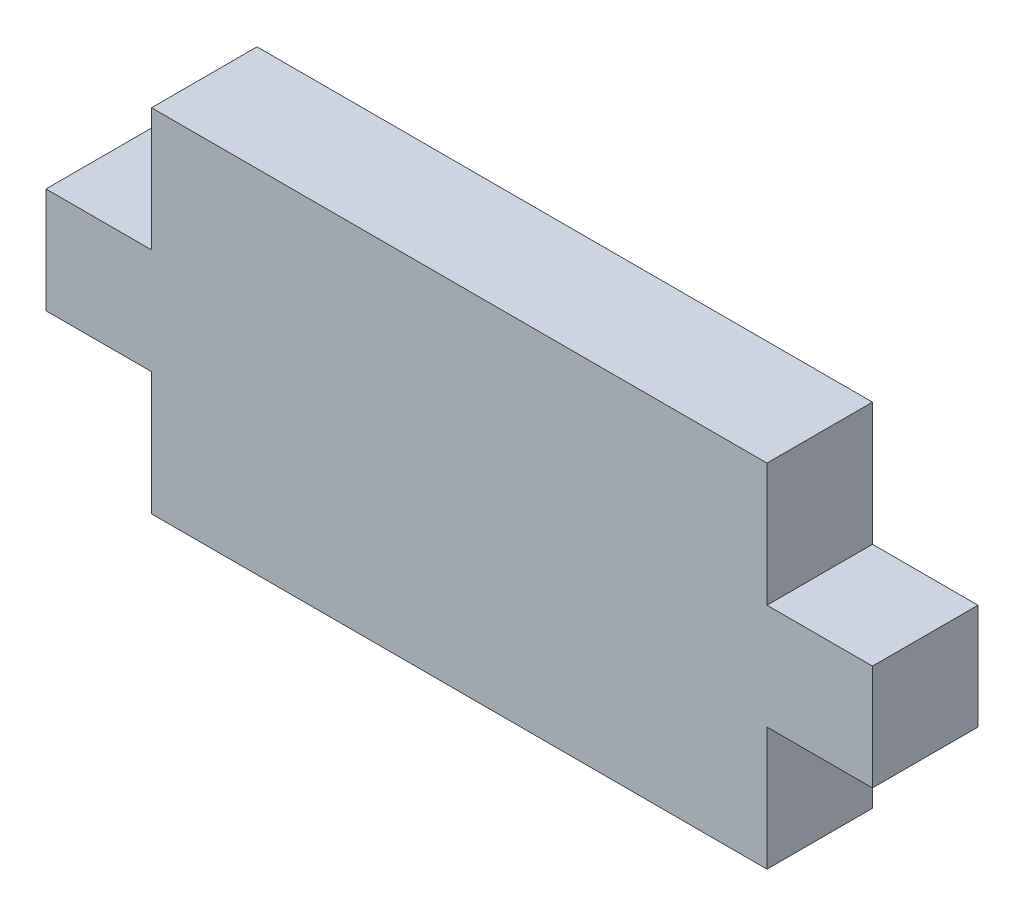
ISO-10303-21;
HEADER;
FILE_DESCRIPTION(('STEP AP214'),'2;1');
FILE_NAME('part.step','',(''),(''),'','','');
FILE_SCHEMA(('AUTOMOTIVE_DESIGN { 1 0 10303 214 1 1 1 1 }'));
ENDSEC;
DATA;
#1=APPLICATION_CONTEXT('core data for automotive mechanical design processes');
#2=APPLICATION_PROTOCOL_DEFINITION('international standard','automotive_design',2000,#1);
#3=PRODUCT_CONTEXT('',#1,'mechanical');
#4=PRODUCT('Part','Part','',(#3));
#5=PRODUCT_RELATED_PRODUCT_CATEGORY('part','',(#4));
#6=PRODUCT_DEFINITION_FORMATION('','',#4);
#7=PRODUCT_DEFINITION_CONTEXT('part definition',#1,'design');
#8=PRODUCT_DEFINITION('design','',#6,#7);
#9=PRODUCT_DEFINITION_SHAPE('','',#8);
#10=(LENGTH_UNIT() NAMED_UNIT(*) SI_UNIT(.MILLI.,.METRE.));
#11=(NAMED_UNIT(*) PLANE_ANGLE_UNIT() SI_UNIT($,.RADIAN.));
#12=(NAMED_UNIT(*) SI_UNIT($,.STERADIAN.) SOLID_ANGLE_UNIT());
#13=UNCERTAINTY_MEASURE_WITH_UNIT(LENGTH_MEASURE(1.E-05),#10,'distance_accuracy_value','');
#14=(GEOMETRIC_REPRESENTATION_CONTEXT(3) GLOBAL_UNCERTAINTY_ASSIGNED_CONTEXT((#13)) GLOBAL_UNIT_ASSIGNED_CONTEXT((#10,
#11,#12)) REPRESENTATION_CONTEXT('',''));
#15=CARTESIAN_POINT('',(0.,0.,0.));
#16=DIRECTION('',(0.,0.,1.));
#17=DIRECTION('',(1.,0.,0.));
#18=AXIS2_PLACEMENT_3D('',#15,#16,#17);
#19=CARTESIAN_POINT('',(-23.5,0.,6.));
#20=DIRECTION('',(-1.,0.,0.));
#21=DIRECTION('',(0.,0.,1.));
#22=AXIS2_PLACEMENT_3D('',#19,#20,#21);
#23=PLANE('',#22);
#24=DIRECTION('',(0.,1.,0.));
#25=VECTOR('',#24,1.);
#26=CARTESIAN_POINT('',(-23.5,0.,0.));
#27=LINE('',#26,#25);
#28=CARTESIAN_POINT('',(-23.5,-3.,0.));
#29=VERTEX_POINT('',#28);
#30=CARTESIAN_POINT('',(-23.5,3.,0.));
#31=VERTEX_POINT('',#30);
#32=EDGE_CURVE('E156',#29,#31,#27,.T.);
#33=ORIENTED_EDGE('',*,*,#32,.F.);
#34=DIRECTION('',(0.,0.,-1.));
#35=VECTOR('',#34,1.);
#36=CARTESIAN_POINT('',(-23.5,-3.,6.));
#37=LINE('',#36,#35);
#38=CARTESIAN_POINT('',(-23.5,-3.,6.));
#39=VERTEX_POINT('',#38);
#40=EDGE_CURVE('E11',#39,#29,#37,.T.);
#41=ORIENTED_EDGE('',*,*,#40,.F.);
#42=DIRECTION('',(0.,1.,0.));
#43=VECTOR('',#42,1.);
#44=CARTESIAN_POINT('',(-23.5,0.,6.));
#45=LINE('',#44,#43);
#46=CARTESIAN_POINT('',(-23.5,3.,6.));
#47=VERTEX_POINT('',#46);
#48=EDGE_CURVE('E184',#39,#47,#45,.T.);
#49=ORIENTED_EDGE('',*,*,#48,.T.);
#50=DIRECTION('',(0.,0.,-1.));
#51=VECTOR('',#50,1.);
#52=CARTESIAN_POINT('',(-23.5,3.,6.));
#53=LINE('',#52,#51);
#54=EDGE_CURVE('E55',#47,#31,#53,.T.);
#55=ORIENTED_EDGE('',*,*,#54,.T.);
#56=EDGE_LOOP('',(#33,#41,#49,#55));
#57=FACE_BOUND('',#56,.T.);
#58=ADVANCED_FACE('F39',(#57),#23,.T.);
#59=CARTESIAN_POINT('',(0.,-3.00000000000003,6.));
#60=DIRECTION('',(0.,1.,0.));
#61=DIRECTION('',(-1.,0.,0.));
#62=AXIS2_PLACEMENT_3D('',#59,#60,#61);
#63=PLANE('',#62);
#64=DIRECTION('',(1.,0.,0.));
#65=VECTOR('',#64,1.);
#66=CARTESIAN_POINT('',(0.,-3.00000000000003,0.));
#67=LINE('',#66,#65);
#68=CARTESIAN_POINT('',(-17.5,-3.00000000000001,0.));
#69=VERTEX_POINT('',#68);
#70=EDGE_CURVE('E158',#29,#69,#67,.T.);
#71=ORIENTED_EDGE('',*,*,#70,.T.);
#72=DIRECTION('',(0.,0.,-1.));
#73=VECTOR('',#72,1.);
#74=CARTESIAN_POINT('',(-17.5,-3.00000000000001,6.));
#75=LINE('',#74,#73);
#76=CARTESIAN_POINT('',(-17.5,-3.00000000000001,6.));
#77=VERTEX_POINT('',#76);
#78=EDGE_CURVE('E47',#77,#69,#75,.T.);
#79=ORIENTED_EDGE('',*,*,#78,.F.);
#80=DIRECTION('',(1.,0.,0.));
#81=VECTOR('',#80,1.);
#82=CARTESIAN_POINT('',(0.,-3.00000000000003,6.));
#83=LINE('',#82,#81);
#84=EDGE_CURVE('E227',#39,#77,#83,.T.);
#85=ORIENTED_EDGE('',*,*,#84,.F.);
#86=ORIENTED_EDGE('',*,*,#40,.T.);
#87=EDGE_LOOP('',(#71,#79,#85,#86));
#88=FACE_BOUND('',#87,.T.);
#89=ADVANCED_FACE('F258',(#88),#63,.F.);
#90=CARTESIAN_POINT('',(-17.5,0.,6.));
#91=DIRECTION('',(1.,0.,0.));
#92=DIRECTION('',(0.,0.,-1.));
#93=AXIS2_PLACEMENT_3D('',#90,#91,#92);
#94=PLANE('',#93);
#95=DIRECTION('',(0.,-1.,0.));
#96=VECTOR('',#95,1.);
#97=CARTESIAN_POINT('',(-17.5,0.,0.));
#98=LINE('',#97,#96);
#99=CARTESIAN_POINT('',(-17.5,-10.,0.));
#100=VERTEX_POINT('',#99);
#101=EDGE_CURVE('E160',#69,#100,#98,.T.);
#102=ORIENTED_EDGE('',*,*,#101,.T.);
#103=DIRECTION('',(0.,0.,-1.));
#104=VECTOR('',#103,1.);
#105=CARTESIAN_POINT('',(-17.5,-10.,6.));
#106=LINE('',#105,#104);
#107=CARTESIAN_POINT('',(-17.5,-10.,6.));
#108=VERTEX_POINT('',#107);
#109=EDGE_CURVE('E200',#108,#100,#106,.T.);
#110=ORIENTED_EDGE('',*,*,#109,.F.);
#111=DIRECTION('',(0.,-1.,0.));
#112=VECTOR('',#111,1.);
#113=CARTESIAN_POINT('',(-17.5,0.,6.));
#114=LINE('',#113,#112);
#115=EDGE_CURVE('E209',#77,#108,#114,.T.);
#116=ORIENTED_EDGE('',*,*,#115,.F.);
#117=ORIENTED_EDGE('',*,*,#78,.T.);
#118=EDGE_LOOP('',(#102,#110,#116,#117));
#119=FACE_BOUND('',#118,.T.);
#120=ADVANCED_FACE('F207',(#119),#94,.F.);
#121=CARTESIAN_POINT('',(0.,-10.,6.));
#122=DIRECTION('',(0.,1.,0.));
#123=DIRECTION('',(0.,0.,1.));
#124=AXIS2_PLACEMENT_3D('',#121,#122,#123);
#125=PLANE('',#124);
#126=DIRECTION('',(1.,0.,0.));
#127=VECTOR('',#126,1.);
#128=CARTESIAN_POINT('',(0.,-10.,0.));
#129=LINE('',#128,#127);
#130=CARTESIAN_POINT('',(17.5,-10.,0.));
#131=VERTEX_POINT('',#130);
#132=EDGE_CURVE('E162',#100,#131,#129,.T.);
#133=ORIENTED_EDGE('',*,*,#132,.T.);
#134=DIRECTION('',(0.,0.,-1.));
#135=VECTOR('',#134,1.);
#136=CARTESIAN_POINT('',(17.5,-10.,6.));
#137=LINE('',#136,#135);
#138=CARTESIAN_POINT('',(17.5,-10.,6.));
#139=VERTEX_POINT('',#138);
#140=EDGE_CURVE('E198',#139,#131,#137,.T.);
#141=ORIENTED_EDGE('',*,*,#140,.F.);
#142=DIRECTION('',(1.,0.,0.));
#143=VECTOR('',#142,1.);
#144=CARTESIAN_POINT('',(0.,-10.,6.));
#145=LINE('',#144,#143);
#146=EDGE_CURVE('E221',#108,#139,#145,.T.);
#147=ORIENTED_EDGE('',*,*,#146,.F.);
#148=ORIENTED_EDGE('',*,*,#109,.T.);
#149=EDGE_LOOP('',(#133,#141,#147,#148));
#150=FACE_BOUND('',#149,.T.);
#151=ADVANCED_FACE('F218',(#150),#125,.F.);
#152=CARTESIAN_POINT('',(17.5,0.,6.));
#153=DIRECTION('',(1.,0.,0.));
#154=DIRECTION('',(0.,1.,0.));
#155=AXIS2_PLACEMENT_3D('',#152,#153,#154);
#156=PLANE('',#155);
#157=DIRECTION('',(0.,-1.,0.));
#158=VECTOR('',#157,1.);
#159=CARTESIAN_POINT('',(17.5,0.,0.));
#160=LINE('',#159,#158);
#161=CARTESIAN_POINT('',(17.5,-3.,0.));
#162=VERTEX_POINT('',#161);
#163=EDGE_CURVE('E165',#162,#131,#160,.T.);
#164=ORIENTED_EDGE('',*,*,#163,.F.);
#165=DIRECTION('',(0.,0.,-1.));
#166=VECTOR('',#165,1.);
#167=CARTESIAN_POINT('',(17.5,-3.,6.));
#168=LINE('',#167,#166);
#169=CARTESIAN_POINT('',(17.5,-3.,6.));
#170=VERTEX_POINT('',#169);
#171=EDGE_CURVE('E196',#170,#162,#168,.T.);
#172=ORIENTED_EDGE('',*,*,#171,.F.);
#173=DIRECTION('',(0.,-1.,0.));
#174=VECTOR('',#173,1.);
#175=CARTESIAN_POINT('',(17.5,0.,6.));
#176=LINE('',#175,#174);
#177=EDGE_CURVE('E223',#170,#139,#176,.T.);
#178=ORIENTED_EDGE('',*,*,#177,.T.);
#179=ORIENTED_EDGE('',*,*,#140,.T.);
#180=EDGE_LOOP('',(#164,#172,#178,#179));
#181=FACE_BOUND('',#180,.T.);
#182=ADVANCED_FACE('F269',(#181),#156,.T.);
#183=CARTESIAN_POINT('',(0.,-3.00000000000002,6.));
#184=DIRECTION('',(0.,-1.,0.));
#185=DIRECTION('',(1.,0.,0.));
#186=AXIS2_PLACEMENT_3D('',#183,#184,#185);
#187=PLANE('',#186);
#188=DIRECTION('',(-1.,0.,0.));
#189=VECTOR('',#188,1.);
#190=CARTESIAN_POINT('',(0.,-3.00000000000002,0.));
#191=LINE('',#190,#189);
#192=CARTESIAN_POINT('',(23.5,-3.,0.));
#193=VERTEX_POINT('',#192);
#194=EDGE_CURVE('E168',#193,#162,#191,.T.);
#195=ORIENTED_EDGE('',*,*,#194,.F.);
#196=DIRECTION('',(0.,0.,-1.));
#197=VECTOR('',#196,1.);
#198=CARTESIAN_POINT('',(23.5,-3.,6.));
#199=LINE('',#198,#197);
#200=CARTESIAN_POINT('',(23.5,-3.,6.));
#201=VERTEX_POINT('',#200);
#202=EDGE_CURVE('E194',#201,#193,#199,.T.);
#203=ORIENTED_EDGE('',*,*,#202,.F.);
#204=DIRECTION('',(-1.,0.,0.));
#205=VECTOR('',#204,1.);
#206=CARTESIAN_POINT('',(0.,-3.00000000000002,6.));
#207=LINE('',#206,#205);
#208=EDGE_CURVE('E225',#201,#170,#207,.T.);
#209=ORIENTED_EDGE('',*,*,#208,.T.);
#210=ORIENTED_EDGE('',*,*,#171,.T.);
#211=EDGE_LOOP('',(#195,#203,#209,#210));
#212=FACE_BOUND('',#211,.T.);
#213=ADVANCED_FACE('F272',(#212),#187,.T.);
#214=CARTESIAN_POINT('',(23.5,0.,6.));
#215=DIRECTION('',(-1.,0.,0.));
#216=DIRECTION('',(0.,0.,1.));
#217=AXIS2_PLACEMENT_3D('',#214,#215,#216);
#218=PLANE('',#217);
#219=DIRECTION('',(0.,1.,0.));
#220=VECTOR('',#219,1.);
#221=CARTESIAN_POINT('',(23.5,0.,0.));
#222=LINE('',#221,#220);
#223=CARTESIAN_POINT('',(23.5,3.,0.));
#224=VERTEX_POINT('',#223);
#225=EDGE_CURVE('E171',#193,#224,#222,.T.);
#226=ORIENTED_EDGE('',*,*,#225,.T.);
#227=DIRECTION('',(0.,0.,-1.));
#228=VECTOR('',#227,1.);
#229=CARTESIAN_POINT('',(23.5,3.,6.));
#230=LINE('',#229,#228);
#231=CARTESIAN_POINT('',(23.5,3.,6.));
#232=VERTEX_POINT('',#231);
#233=EDGE_CURVE('E191',#232,#224,#230,.T.);
#234=ORIENTED_EDGE('',*,*,#233,.F.);
#235=DIRECTION('',(0.,1.,0.));
#236=VECTOR('',#235,1.);
#237=CARTESIAN_POINT('',(23.5,0.,6.));
#238=LINE('',#237,#236);
#239=EDGE_CURVE('E233',#201,#232,#238,.T.);
#240=ORIENTED_EDGE('',*,*,#239,.F.);
#241=ORIENTED_EDGE('',*,*,#202,.T.);
#242=EDGE_LOOP('',(#226,#234,#240,#241));
#243=FACE_BOUND('',#242,.T.);
#244=ADVANCED_FACE('F276',(#243),#218,.F.);
#245=CARTESIAN_POINT('',(0.,3.00000000000002,6.));
#246=DIRECTION('',(0.,-1.,0.));
#247=DIRECTION('',(1.,0.,0.));
#248=AXIS2_PLACEMENT_3D('',#245,#246,#247);
#249=PLANE('',#248);
#250=DIRECTION('',(-1.,0.,0.));
#251=VECTOR('',#250,1.);
#252=CARTESIAN_POINT('',(0.,3.00000000000002,0.));
#253=LINE('',#252,#251);
#254=CARTESIAN_POINT('',(17.5,3.,0.));
#255=VERTEX_POINT('',#254);
#256=EDGE_CURVE('E173',#224,#255,#253,.T.);
#257=ORIENTED_EDGE('',*,*,#256,.T.);
#258=DIRECTION('',(0.,0.,-1.));
#259=VECTOR('',#258,1.);
#260=CARTESIAN_POINT('',(17.5,3.,6.));
#261=LINE('',#260,#259);
#262=CARTESIAN_POINT('',(17.5,3.,6.));
#263=VERTEX_POINT('',#262);
#264=EDGE_CURVE('E188',#263,#255,#261,.T.);
#265=ORIENTED_EDGE('',*,*,#264,.F.);
#266=DIRECTION('',(-1.,0.,0.));
#267=VECTOR('',#266,1.);
#268=CARTESIAN_POINT('',(0.,3.00000000000002,6.));
#269=LINE('',#268,#267);
#270=EDGE_CURVE('E235',#232,#263,#269,.T.);
#271=ORIENTED_EDGE('',*,*,#270,.F.);
#272=ORIENTED_EDGE('',*,*,#233,.T.);
#273=EDGE_LOOP('',(#257,#265,#271,#272));
#274=FACE_BOUND('',#273,.T.);
#275=ADVANCED_FACE('F242',(#274),#249,.F.);
#276=CARTESIAN_POINT('',(17.5,0.,6.));
#277=DIRECTION('',(-1.,0.,0.));
#278=DIRECTION('',(0.,-1.,0.));
#279=AXIS2_PLACEMENT_3D('',#276,#277,#278);
#280=PLANE('',#279);
#281=DIRECTION('',(0.,1.,0.));
#282=VECTOR('',#281,1.);
#283=CARTESIAN_POINT('',(17.5,0.,0.));
#284=LINE('',#283,#282);
#285=CARTESIAN_POINT('',(17.5,10.,0.));
#286=VERTEX_POINT('',#285);
#287=EDGE_CURVE('E175',#255,#286,#284,.T.);
#288=ORIENTED_EDGE('',*,*,#287,.T.);
#289=DIRECTION('',(0.,0.,-1.));
#290=VECTOR('',#289,1.);
#291=CARTESIAN_POINT('',(17.5,10.,6.));
#292=LINE('',#291,#290);
#293=CARTESIAN_POINT('',(17.5,10.,6.));
#294=VERTEX_POINT('',#293);
#295=EDGE_CURVE('E138',#294,#286,#292,.T.);
#296=ORIENTED_EDGE('',*,*,#295,.F.);
#297=DIRECTION('',(0.,1.,0.));
#298=VECTOR('',#297,1.);
#299=CARTESIAN_POINT('',(17.5,0.,6.));
#300=LINE('',#299,#298);
#301=EDGE_CURVE('E147',#263,#294,#300,.T.);
#302=ORIENTED_EDGE('',*,*,#301,.F.);
#303=ORIENTED_EDGE('',*,*,#264,.T.);
#304=EDGE_LOOP('',(#288,#296,#302,#303));
#305=FACE_BOUND('',#304,.T.);
#306=ADVANCED_FACE('F246',(#305),#280,.F.);
#307=CARTESIAN_POINT('',(0.,10.,6.));
#308=DIRECTION('',(0.,1.,0.));
#309=DIRECTION('',(0.,0.,1.));
#310=AXIS2_PLACEMENT_3D('',#307,#308,#309);
#311=PLANE('',#310);
#312=DIRECTION('',(1.,0.,0.));
#313=VECTOR('',#312,1.);
#314=CARTESIAN_POINT('',(0.,10.,0.));
#315=LINE('',#314,#313);
#316=CARTESIAN_POINT('',(-17.5,10.,0.));
#317=VERTEX_POINT('',#316);
#318=EDGE_CURVE('E134',#317,#286,#315,.T.);
#319=ORIENTED_EDGE('',*,*,#318,.F.);
#320=DIRECTION('',(0.,0.,-1.));
#321=VECTOR('',#320,1.);
#322=CARTESIAN_POINT('',(-17.5,10.,6.));
#323=LINE('',#322,#321);
#324=CARTESIAN_POINT('',(-17.5,10.,6.));
#325=VERTEX_POINT('',#324);
#326=EDGE_CURVE('E129',#325,#317,#323,.T.);
#327=ORIENTED_EDGE('',*,*,#326,.F.);
#328=DIRECTION('',(1.,0.,0.));
#329=VECTOR('',#328,1.);
#330=CARTESIAN_POINT('',(0.,10.,6.));
#331=LINE('',#330,#329);
#332=EDGE_CURVE('E132',#325,#294,#331,.T.);
#333=ORIENTED_EDGE('',*,*,#332,.T.);
#334=ORIENTED_EDGE('',*,*,#295,.T.);
#335=EDGE_LOOP('',(#319,#327,#333,#334));
#336=FACE_BOUND('',#335,.T.);
#337=ADVANCED_FACE('F131',(#336),#311,.T.);
#338=CARTESIAN_POINT('',(-17.5,0.,6.));
#339=DIRECTION('',(-1.,0.,0.));
#340=DIRECTION('',(0.,0.,1.));
#341=AXIS2_PLACEMENT_3D('',#338,#339,#340);
#342=PLANE('',#341);
#343=DIRECTION('',(0.,1.,0.));
#344=VECTOR('',#343,1.);
#345=CARTESIAN_POINT('',(-17.5,0.,0.));
#346=LINE('',#345,#344);
#347=CARTESIAN_POINT('',(-17.5,3.,0.));
#348=VERTEX_POINT('',#347);
#349=EDGE_CURVE('E179',#348,#317,#346,.T.);
#350=ORIENTED_EDGE('',*,*,#349,.F.);
#351=DIRECTION('',(0.,0.,-1.));
#352=VECTOR('',#351,1.);
#353=CARTESIAN_POINT('',(-17.5,3.,6.));
#354=LINE('',#353,#352);
#355=CARTESIAN_POINT('',(-17.5,3.,6.));
#356=VERTEX_POINT('',#355);
#357=EDGE_CURVE('E92',#356,#348,#354,.T.);
#358=ORIENTED_EDGE('',*,*,#357,.F.);
#359=DIRECTION('',(0.,1.,0.));
#360=VECTOR('',#359,1.);
#361=CARTESIAN_POINT('',(-17.5,0.,6.));
#362=LINE('',#361,#360);
#363=EDGE_CURVE('E145',#356,#325,#362,.T.);
#364=ORIENTED_EDGE('',*,*,#363,.T.);
#365=ORIENTED_EDGE('',*,*,#326,.T.);
#366=EDGE_LOOP('',(#350,#358,#364,#365));
#367=FACE_BOUND('',#366,.T.);
#368=ADVANCED_FACE('F150',(#367),#342,.T.);
#369=CARTESIAN_POINT('',(0.,3.,6.));
#370=DIRECTION('',(0.,1.,0.));
#371=DIRECTION('',(0.,0.,1.));
#372=AXIS2_PLACEMENT_3D('',#369,#370,#371);
#373=PLANE('',#372);
#374=DIRECTION('',(1.,0.,0.));
#375=VECTOR('',#374,1.);
#376=CARTESIAN_POINT('',(0.,3.,0.));
#377=LINE('',#376,#375);
#378=EDGE_CURVE('E181',#31,#348,#377,.T.);
#379=ORIENTED_EDGE('',*,*,#378,.F.);
#380=ORIENTED_EDGE('',*,*,#54,.F.);
#381=DIRECTION('',(1.,0.,0.));
#382=VECTOR('',#381,1.);
#383=CARTESIAN_POINT('',(0.,3.,6.));
#384=LINE('',#383,#382);
#385=EDGE_CURVE('E151',#47,#356,#384,.T.);
#386=ORIENTED_EDGE('',*,*,#385,.T.);
#387=ORIENTED_EDGE('',*,*,#357,.T.);
#388=EDGE_LOOP('',(#379,#380,#386,#387));
#389=FACE_BOUND('',#388,.T.);
#390=ADVANCED_FACE('F247',(#389),#373,.T.);
#391=CARTESIAN_POINT('',(0.,0.,6.));
#392=DIRECTION('',(0.,0.,1.));
#393=DIRECTION('',(1.,0.,0.));
#394=AXIS2_PLACEMENT_3D('',#391,#392,#393);
#395=PLANE('',#394);
#396=ORIENTED_EDGE('',*,*,#48,.F.);
#397=ORIENTED_EDGE('',*,*,#84,.T.);
#398=ORIENTED_EDGE('',*,*,#115,.T.);
#399=ORIENTED_EDGE('',*,*,#146,.T.);
#400=ORIENTED_EDGE('',*,*,#177,.F.);
#401=ORIENTED_EDGE('',*,*,#208,.F.);
#402=ORIENTED_EDGE('',*,*,#239,.T.);
#403=ORIENTED_EDGE('',*,*,#270,.T.);
#404=ORIENTED_EDGE('',*,*,#301,.T.);
#405=ORIENTED_EDGE('',*,*,#332,.F.);
#406=ORIENTED_EDGE('',*,*,#363,.F.);
#407=ORIENTED_EDGE('',*,*,#385,.F.);
#408=EDGE_LOOP('',(#396,#397,#398,#399,#400,#401,#402,#403,#404,#405,#406,#407));
#409=FACE_BOUND('',#408,.T.);
#410=ADVANCED_FACE('F143',(#409),#395,.T.);
#411=CARTESIAN_POINT('',(0.,0.,0.));
#412=DIRECTION('',(0.,0.,1.));
#413=DIRECTION('',(1.,0.,0.));
#414=AXIS2_PLACEMENT_3D('',#411,#412,#413);
#415=PLANE('',#414);
#416=ORIENTED_EDGE('',*,*,#32,.T.);
#417=ORIENTED_EDGE('',*,*,#378,.T.);
#418=ORIENTED_EDGE('',*,*,#349,.T.);
#419=ORIENTED_EDGE('',*,*,#318,.T.);
#420=ORIENTED_EDGE('',*,*,#287,.F.);
#421=ORIENTED_EDGE('',*,*,#256,.F.);
#422=ORIENTED_EDGE('',*,*,#225,.F.);
#423=ORIENTED_EDGE('',*,*,#194,.T.);
#424=ORIENTED_EDGE('',*,*,#163,.T.);
#425=ORIENTED_EDGE('',*,*,#132,.F.);
#426=ORIENTED_EDGE('',*,*,#101,.F.);
#427=ORIENTED_EDGE('',*,*,#70,.F.);
#428=EDGE_LOOP('',(#416,#417,#418,#419,#420,#421,#422,#423,#424,#425,#426,#427));
#429=FACE_BOUND('',#428,.T.);
#430=ADVANCED_FACE('F214',(#429),#415,.F.);
#431=CLOSED_SHELL('',(#58,#89,#120,#151,#182,#213,#244,#275,#306,#337,#368,#390,#410,#430));
#432=MANIFOLD_SOLID_BREP('B2',#431);
#433=ADVANCED_BREP_SHAPE_REPRESENTATION('',(#18,#432),#14);
#434=SHAPE_DEFINITION_REPRESENTATION(#9,#433);
ENDSEC;
END-ISO-10303-21;
